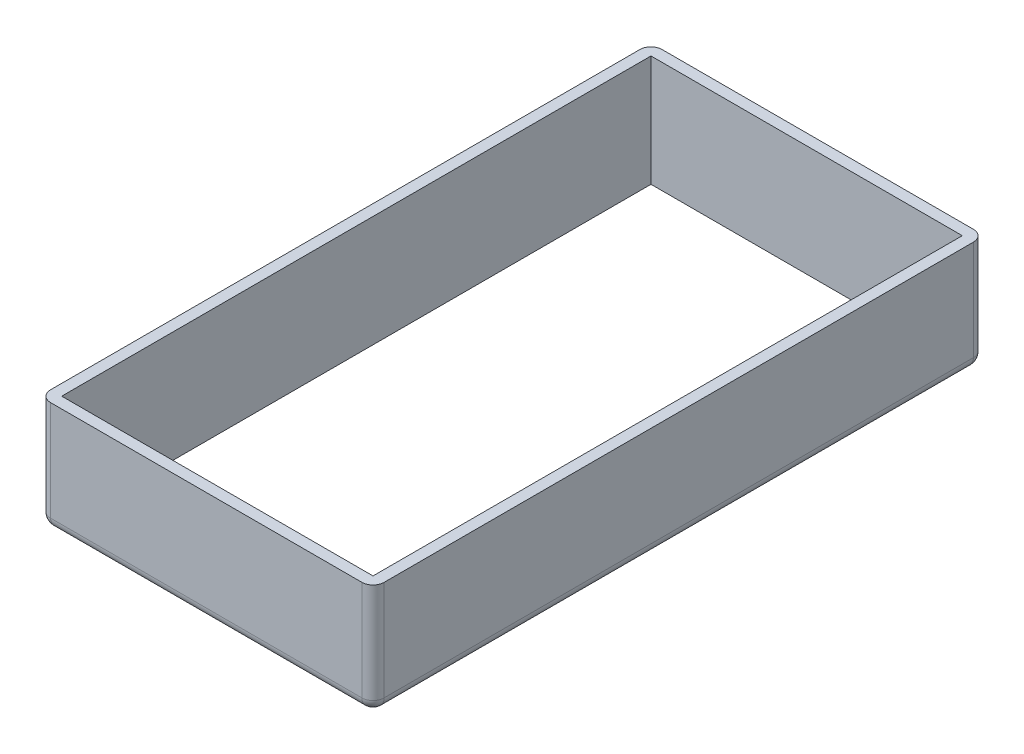
ISO-10303-21;
HEADER;
FILE_DESCRIPTION(('STEP AP214'),'2;1');
FILE_NAME('part.step','',(''),(''),'','','');
FILE_SCHEMA(('AUTOMOTIVE_DESIGN { 1 0 10303 214 1 1 1 1 }'));
ENDSEC;
DATA;
#1=APPLICATION_CONTEXT('core data for automotive mechanical design processes');
#2=APPLICATION_PROTOCOL_DEFINITION('international standard','automotive_design',2000,#1);
#3=PRODUCT_CONTEXT('',#1,'mechanical');
#4=PRODUCT('Part','Part','',(#3));
#5=PRODUCT_RELATED_PRODUCT_CATEGORY('part','',(#4));
#6=PRODUCT_DEFINITION_FORMATION('','',#4);
#7=PRODUCT_DEFINITION_CONTEXT('part definition',#1,'design');
#8=PRODUCT_DEFINITION('design','',#6,#7);
#9=PRODUCT_DEFINITION_SHAPE('','',#8);
#10=(LENGTH_UNIT() NAMED_UNIT(*) SI_UNIT(.MILLI.,.METRE.));
#11=(NAMED_UNIT(*) PLANE_ANGLE_UNIT() SI_UNIT($,.RADIAN.));
#12=(NAMED_UNIT(*) SI_UNIT($,.STERADIAN.) SOLID_ANGLE_UNIT());
#13=UNCERTAINTY_MEASURE_WITH_UNIT(LENGTH_MEASURE(1.E-05),#10,'distance_accuracy_value','');
#14=(GEOMETRIC_REPRESENTATION_CONTEXT(3) GLOBAL_UNCERTAINTY_ASSIGNED_CONTEXT((#13)) GLOBAL_UNIT_ASSIGNED_CONTEXT((#10,
#11,#12)) REPRESENTATION_CONTEXT('',''));
#15=CARTESIAN_POINT('',(0.,0.,0.));
#16=DIRECTION('',(0.,0.,1.));
#17=DIRECTION('',(1.,0.,0.));
#18=AXIS2_PLACEMENT_3D('',#15,#16,#17);
#19=CARTESIAN_POINT('',(-113.513034188034,25.4,-55.3725427350427));
#20=DIRECTION('',(1.,0.,0.));
#21=DIRECTION('',(0.,0.,-1.));
#22=AXIS2_PLACEMENT_3D('',#19,#20,#21);
#23=PLANE('',#22);
#24=DIRECTION('',(0.,0.,1.));
#25=VECTOR('',#24,1.);
#26=CARTESIAN_POINT('',(-113.513034188034,25.4,-55.3725427350427));
#27=LINE('',#26,#25);
#28=CARTESIAN_POINT('',(-113.513034188034,25.4,-52.8325427350427));
#29=VERTEX_POINT('',#28);
#30=CARTESIAN_POINT('',(-113.513034188034,25.4,81.7874572649573));
#31=VERTEX_POINT('',#30);
#32=EDGE_CURVE('E226',#29,#31,#27,.T.);
#33=ORIENTED_EDGE('',*,*,#32,.F.);
#34=DIRECTION('',(0.,-1.,0.));
#35=VECTOR('',#34,1.);
#36=CARTESIAN_POINT('',(-113.513034188034,25.4,-52.8325427350427));
#37=LINE('',#36,#35);
#38=CARTESIAN_POINT('',(-113.513034188034,2.54,-52.8325427350427));
#39=VERTEX_POINT('',#38);
#40=EDGE_CURVE('E67',#29,#39,#37,.T.);
#41=ORIENTED_EDGE('',*,*,#40,.T.);
#42=DIRECTION('',(0.,0.,1.));
#43=VECTOR('',#42,1.);
#44=CARTESIAN_POINT('',(-113.513034188034,2.54,-55.3725427350427));
#45=LINE('',#44,#43);
#46=CARTESIAN_POINT('',(-113.513034188034,2.54,81.7874572649573));
#47=VERTEX_POINT('',#46);
#48=EDGE_CURVE('E193',#39,#47,#45,.T.);
#49=ORIENTED_EDGE('',*,*,#48,.T.);
#50=DIRECTION('',(0.,-1.,0.));
#51=VECTOR('',#50,1.);
#52=CARTESIAN_POINT('',(-113.513034188034,25.4,81.7874572649573));
#53=LINE('',#52,#51);
#54=EDGE_CURVE('E191',#47,#31,#53,.F.);
#55=ORIENTED_EDGE('',*,*,#54,.T.);
#56=EDGE_LOOP('',(#33,#41,#49,#55));
#57=FACE_BOUND('',#56,.T.);
#58=ADVANCED_FACE('F43',(#57),#23,.F.);
#59=CARTESIAN_POINT('',(-113.513034188034,25.4,84.3274572649573));
#60=DIRECTION('',(0.,0.,-1.));
#61=DIRECTION('',(-1.,0.,0.));
#62=AXIS2_PLACEMENT_3D('',#59,#60,#61);
#63=PLANE('',#62);
#64=DIRECTION('',(1.,0.,0.));
#65=VECTOR('',#64,1.);
#66=CARTESIAN_POINT('',(-113.513034188034,2.54,84.3274572649573));
#67=LINE('',#66,#65);
#68=CARTESIAN_POINT('',(-110.973034188034,2.54,84.3274572649573));
#69=VERTEX_POINT('',#68);
#70=CARTESIAN_POINT('',(-39.8530341880342,2.54,84.3274572649573));
#71=VERTEX_POINT('',#70);
#72=EDGE_CURVE('E257',#69,#71,#67,.T.);
#73=ORIENTED_EDGE('',*,*,#72,.T.);
#74=DIRECTION('',(0.,-1.,0.));
#75=VECTOR('',#74,1.);
#76=CARTESIAN_POINT('',(-39.8530341880342,25.4,84.3274572649573));
#77=LINE('',#76,#75);
#78=CARTESIAN_POINT('',(-39.8530341880342,25.4,84.3274572649573));
#79=VERTEX_POINT('',#78);
#80=EDGE_CURVE('E260',#71,#79,#77,.F.);
#81=ORIENTED_EDGE('',*,*,#80,.T.);
#82=DIRECTION('',(1.,0.,0.));
#83=VECTOR('',#82,1.);
#84=CARTESIAN_POINT('',(-113.513034188034,25.4,84.3274572649573));
#85=LINE('',#84,#83);
#86=CARTESIAN_POINT('',(-110.973034188034,25.4,84.3274572649573));
#87=VERTEX_POINT('',#86);
#88=EDGE_CURVE('E246',#87,#79,#85,.T.);
#89=ORIENTED_EDGE('',*,*,#88,.F.);
#90=DIRECTION('',(0.,-1.,0.));
#91=VECTOR('',#90,1.);
#92=CARTESIAN_POINT('',(-110.973034188034,25.4,84.3274572649573));
#93=LINE('',#92,#91);
#94=EDGE_CURVE('E255',#87,#69,#93,.T.);
#95=ORIENTED_EDGE('',*,*,#94,.T.);
#96=EDGE_LOOP('',(#73,#81,#89,#95));
#97=FACE_BOUND('',#96,.T.);
#98=ADVANCED_FACE('F307',(#97),#63,.F.);
#99=CARTESIAN_POINT('',(-37.3130341880342,25.4,-55.3725427350427));
#100=DIRECTION('',(-1.,0.,0.));
#101=DIRECTION('',(0.,0.,1.));
#102=AXIS2_PLACEMENT_3D('',#99,#100,#101);
#103=PLANE('',#102);
#104=DIRECTION('',(0.,0.,-1.));
#105=VECTOR('',#104,1.);
#106=CARTESIAN_POINT('',(-37.3130341880342,2.54,-55.3725427350427));
#107=LINE('',#106,#105);
#108=CARTESIAN_POINT('',(-37.3130341880342,2.54,81.7874572649573));
#109=VERTEX_POINT('',#108);
#110=CARTESIAN_POINT('',(-37.3130341880342,2.54,-52.8325427350427));
#111=VERTEX_POINT('',#110);
#112=EDGE_CURVE('E182',#109,#111,#107,.T.);
#113=ORIENTED_EDGE('',*,*,#112,.T.);
#114=DIRECTION('',(0.,-1.,0.));
#115=VECTOR('',#114,1.);
#116=CARTESIAN_POINT('',(-37.3130341880342,25.4,-52.8325427350427));
#117=LINE('',#116,#115);
#118=CARTESIAN_POINT('',(-37.3130341880342,25.4,-52.8325427350427));
#119=VERTEX_POINT('',#118);
#120=EDGE_CURVE('E184',#111,#119,#117,.F.);
#121=ORIENTED_EDGE('',*,*,#120,.T.);
#122=DIRECTION('',(0.,0.,-1.));
#123=VECTOR('',#122,1.);
#124=CARTESIAN_POINT('',(-37.3130341880342,25.4,-55.3725427350427));
#125=LINE('',#124,#123);
#126=CARTESIAN_POINT('',(-37.3130341880342,25.4,81.7874572649573));
#127=VERTEX_POINT('',#126);
#128=EDGE_CURVE('E249',#127,#119,#125,.T.);
#129=ORIENTED_EDGE('',*,*,#128,.F.);
#130=DIRECTION('',(0.,-1.,0.));
#131=VECTOR('',#130,1.);
#132=CARTESIAN_POINT('',(-37.3130341880342,25.4,81.7874572649573));
#133=LINE('',#132,#131);
#134=EDGE_CURVE('E177',#127,#109,#133,.T.);
#135=ORIENTED_EDGE('',*,*,#134,.T.);
#136=EDGE_LOOP('',(#113,#121,#129,#135));
#137=FACE_BOUND('',#136,.T.);
#138=ADVANCED_FACE('F283',(#137),#103,.F.);
#139=CARTESIAN_POINT('',(-113.513034188034,25.4,-55.3725427350427));
#140=DIRECTION('',(0.,0.,1.));
#141=DIRECTION('',(1.,0.,0.));
#142=AXIS2_PLACEMENT_3D('',#139,#140,#141);
#143=PLANE('',#142);
#144=DIRECTION('',(-1.,0.,0.));
#145=VECTOR('',#144,1.);
#146=CARTESIAN_POINT('',(-113.513034188034,25.4,-55.3725427350427));
#147=LINE('',#146,#145);
#148=CARTESIAN_POINT('',(-39.8530341880342,25.4,-55.3725427350427));
#149=VERTEX_POINT('',#148);
#150=CARTESIAN_POINT('',(-110.973034188034,25.4,-55.3725427350427));
#151=VERTEX_POINT('',#150);
#152=EDGE_CURVE('E252',#149,#151,#147,.T.);
#153=ORIENTED_EDGE('',*,*,#152,.F.);
#154=DIRECTION('',(0.,-1.,0.));
#155=VECTOR('',#154,1.);
#156=CARTESIAN_POINT('',(-39.8530341880342,25.4,-55.3725427350427));
#157=LINE('',#156,#155);
#158=CARTESIAN_POINT('',(-39.8530341880342,2.54,-55.3725427350427));
#159=VERTEX_POINT('',#158);
#160=EDGE_CURVE('E189',#149,#159,#157,.T.);
#161=ORIENTED_EDGE('',*,*,#160,.T.);
#162=DIRECTION('',(-1.,0.,0.));
#163=VECTOR('',#162,1.);
#164=CARTESIAN_POINT('',(-113.513034188034,2.54,-55.3725427350427));
#165=LINE('',#164,#163);
#166=CARTESIAN_POINT('',(-110.973034188034,2.54,-55.3725427350427));
#167=VERTEX_POINT('',#166);
#168=EDGE_CURVE('E156',#159,#167,#165,.T.);
#169=ORIENTED_EDGE('',*,*,#168,.T.);
#170=DIRECTION('',(0.,-1.,0.));
#171=VECTOR('',#170,1.);
#172=CARTESIAN_POINT('',(-110.973034188034,25.4,-55.3725427350427));
#173=LINE('',#172,#171);
#174=EDGE_CURVE('E186',#167,#151,#173,.F.);
#175=ORIENTED_EDGE('',*,*,#174,.T.);
#176=EDGE_LOOP('',(#153,#161,#169,#175));
#177=FACE_BOUND('',#176,.T.);
#178=ADVANCED_FACE('F275',(#177),#143,.F.);
#179=CARTESIAN_POINT('',(0.,25.4,0.));
#180=DIRECTION('',(0.,1.,0.));
#181=DIRECTION('',(0.,0.,1.));
#182=AXIS2_PLACEMENT_3D('',#179,#180,#181);
#183=PLANE('',#182);
#184=DIRECTION('',(0.,0.,-1.));
#185=VECTOR('',#184,1.);
#186=CARTESIAN_POINT('',(-39.8530341880342,25.4,81.7874572649573));
#187=LINE('',#186,#185);
#188=CARTESIAN_POINT('',(-39.8530341880342,25.4,81.7874572649573));
#189=VERTEX_POINT('',#188);
#190=CARTESIAN_POINT('',(-39.8530341880342,25.4,-52.8325427350427));
#191=VERTEX_POINT('',#190);
#192=EDGE_CURVE('E138',#189,#191,#187,.T.);
#193=ORIENTED_EDGE('',*,*,#192,.F.);
#194=DIRECTION('',(1.,0.,0.));
#195=VECTOR('',#194,1.);
#196=CARTESIAN_POINT('',(-39.8530341880342,25.4,81.7874572649573));
#197=LINE('',#196,#195);
#198=CARTESIAN_POINT('',(-110.973034188034,25.4,81.7874572649573));
#199=VERTEX_POINT('',#198);
#200=EDGE_CURVE('E207',#199,#189,#197,.T.);
#201=ORIENTED_EDGE('',*,*,#200,.F.);
#202=DIRECTION('',(0.,0.,1.));
#203=VECTOR('',#202,1.);
#204=CARTESIAN_POINT('',(-110.973034188034,25.4,81.7874572649573));
#205=LINE('',#204,#203);
#206=CARTESIAN_POINT('',(-110.973034188034,25.4,-52.8325427350427));
#207=VERTEX_POINT('',#206);
#208=EDGE_CURVE('E234',#207,#199,#205,.T.);
#209=ORIENTED_EDGE('',*,*,#208,.F.);
#210=DIRECTION('',(-1.,0.,0.));
#211=VECTOR('',#210,1.);
#212=CARTESIAN_POINT('',(-39.8530341880342,25.4,-52.8325427350427));
#213=LINE('',#212,#211);
#214=EDGE_CURVE('E237',#191,#207,#213,.T.);
#215=ORIENTED_EDGE('',*,*,#214,.F.);
#216=EDGE_LOOP('',(#193,#201,#209,#215));
#217=FACE_BOUND('',#216,.T.);
#218=ORIENTED_EDGE('',*,*,#128,.T.);
#219=CARTESIAN_POINT('',(-39.8530341880342,25.4,-52.8325427350427));
#220=DIRECTION('',(0.,1.,0.));
#221=DIRECTION('',(0.,0.,1.));
#222=AXIS2_PLACEMENT_3D('',#219,#220,#221);
#223=CIRCLE('',#222,2.54);
#224=EDGE_CURVE('E202',#119,#149,#223,.T.);
#225=ORIENTED_EDGE('',*,*,#224,.T.);
#226=ORIENTED_EDGE('',*,*,#152,.T.);
#227=CARTESIAN_POINT('',(-110.973034188034,25.4,-52.8325427350427));
#228=DIRECTION('',(0.,1.,0.));
#229=DIRECTION('',(0.,0.,1.));
#230=AXIS2_PLACEMENT_3D('',#227,#228,#229);
#231=CIRCLE('',#230,2.54);
#232=EDGE_CURVE('E200',#151,#29,#231,.T.);
#233=ORIENTED_EDGE('',*,*,#232,.T.);
#234=ORIENTED_EDGE('',*,*,#32,.T.);
#235=CARTESIAN_POINT('',(-110.973034188034,25.4,81.7874572649573));
#236=DIRECTION('',(0.,1.,0.));
#237=DIRECTION('',(0.,0.,1.));
#238=AXIS2_PLACEMENT_3D('',#235,#236,#237);
#239=CIRCLE('',#238,2.54);
#240=EDGE_CURVE('E196',#31,#87,#239,.T.);
#241=ORIENTED_EDGE('',*,*,#240,.T.);
#242=ORIENTED_EDGE('',*,*,#88,.T.);
#243=CARTESIAN_POINT('',(-39.8530341880342,25.4,81.7874572649573));
#244=DIRECTION('',(0.,1.,0.));
#245=DIRECTION('',(0.,0.,1.));
#246=AXIS2_PLACEMENT_3D('',#243,#244,#245);
#247=CIRCLE('',#246,2.54);
#248=EDGE_CURVE('E198',#79,#127,#247,.T.);
#249=ORIENTED_EDGE('',*,*,#248,.T.);
#250=EDGE_LOOP('',(#218,#225,#226,#233,#234,#241,#242,#249));
#251=FACE_BOUND('',#250,.T.);
#252=ADVANCED_FACE('F239',(#217,#251),#183,.T.);
#253=CARTESIAN_POINT('',(-110.973034188034,25.4,-52.8325427350427));
#254=DIRECTION('',(0.,-1.,0.));
#255=DIRECTION('',(0.,0.,-1.));
#256=AXIS2_PLACEMENT_3D('',#253,#254,#255);
#257=CYLINDRICAL_SURFACE('',#256,2.54);
#258=ORIENTED_EDGE('',*,*,#232,.F.);
#259=ORIENTED_EDGE('',*,*,#174,.F.);
#260=CARTESIAN_POINT('',(-110.973034188034,2.54,-52.8325427350427));
#261=DIRECTION('',(0.,-1.,0.));
#262=DIRECTION('',(0.,0.,-1.));
#263=AXIS2_PLACEMENT_3D('',#260,#261,#262);
#264=CIRCLE('',#263,2.54);
#265=EDGE_CURVE('E222',#39,#167,#264,.T.);
#266=ORIENTED_EDGE('',*,*,#265,.F.);
#267=ORIENTED_EDGE('',*,*,#40,.F.);
#268=EDGE_LOOP('',(#258,#259,#266,#267));
#269=FACE_BOUND('',#268,.T.);
#270=ADVANCED_FACE('F272',(#269),#257,.T.);
#271=CARTESIAN_POINT('',(-39.8530341880342,25.4,-52.8325427350427));
#272=DIRECTION('',(0.,-1.,0.));
#273=DIRECTION('',(0.,0.,-1.));
#274=AXIS2_PLACEMENT_3D('',#271,#272,#273);
#275=CYLINDRICAL_SURFACE('',#274,2.54);
#276=ORIENTED_EDGE('',*,*,#224,.F.);
#277=ORIENTED_EDGE('',*,*,#120,.F.);
#278=CARTESIAN_POINT('',(-39.8530341880342,2.54,-52.8325427350427));
#279=DIRECTION('',(0.,-1.,0.));
#280=DIRECTION('',(0.,0.,-1.));
#281=AXIS2_PLACEMENT_3D('',#278,#279,#280);
#282=CIRCLE('',#281,2.54);
#283=EDGE_CURVE('E160',#159,#111,#282,.T.);
#284=ORIENTED_EDGE('',*,*,#283,.F.);
#285=ORIENTED_EDGE('',*,*,#160,.F.);
#286=EDGE_LOOP('',(#276,#277,#284,#285));
#287=FACE_BOUND('',#286,.T.);
#288=ADVANCED_FACE('F281',(#287),#275,.T.);
#289=CARTESIAN_POINT('',(-113.513034188034,2.54,-52.8325427350427));
#290=DIRECTION('',(-1.,0.,0.));
#291=DIRECTION('',(0.,0.,1.));
#292=AXIS2_PLACEMENT_3D('',#289,#290,#291);
#293=CYLINDRICAL_SURFACE('',#292,2.54);
#294=CARTESIAN_POINT('',(-110.973034188034,2.54,-52.8325427350427));
#295=DIRECTION('',(-1.,0.,0.));
#296=DIRECTION('',(0.,0.,1.));
#297=AXIS2_PLACEMENT_3D('',#294,#295,#296);
#298=CIRCLE('',#297,2.54);
#299=CARTESIAN_POINT('',(-110.973034188034,0.,-52.8325427350427));
#300=VERTEX_POINT('',#299);
#301=EDGE_CURVE('E225',#167,#300,#298,.T.);
#302=ORIENTED_EDGE('',*,*,#301,.F.);
#303=ORIENTED_EDGE('',*,*,#168,.F.);
#304=CARTESIAN_POINT('',(-39.8530341880342,2.54,-52.8325427350427));
#305=DIRECTION('',(1.,0.,0.));
#306=DIRECTION('',(0.,0.,-1.));
#307=AXIS2_PLACEMENT_3D('',#304,#305,#306);
#308=CIRCLE('',#307,2.54);
#309=CARTESIAN_POINT('',(-39.8530341880342,0.,-52.8325427350427));
#310=VERTEX_POINT('',#309);
#311=EDGE_CURVE('E153',#310,#159,#308,.T.);
#312=ORIENTED_EDGE('',*,*,#311,.F.);
#313=DIRECTION('',(-1.,0.,0.));
#314=VECTOR('',#313,1.);
#315=CARTESIAN_POINT('',(0.,0.,-52.8325427350427));
#316=LINE('',#315,#314);
#317=EDGE_CURVE('E143',#300,#310,#316,.F.);
#318=ORIENTED_EDGE('',*,*,#317,.F.);
#319=EDGE_LOOP('',(#302,#303,#312,#318));
#320=FACE_BOUND('',#319,.T.);
#321=ADVANCED_FACE('F155',(#320),#293,.T.);
#322=CARTESIAN_POINT('',(-110.973034188034,2.54,-52.8325427350427));
#323=DIRECTION('',(0.,0.,-1.));
#324=DIRECTION('',(0.,1.,0.));
#325=AXIS2_PLACEMENT_3D('',#322,#323,#324);
#326=SPHERICAL_SURFACE('',#325,2.54);
#327=ORIENTED_EDGE('',*,*,#265,.T.);
#328=ORIENTED_EDGE('',*,*,#301,.T.);
#329=CARTESIAN_POINT('',(-110.973034188034,2.54,-52.8325427350427));
#330=DIRECTION('',(0.,0.,-1.));
#331=DIRECTION('',(-1.,0.,0.));
#332=AXIS2_PLACEMENT_3D('',#329,#330,#331);
#333=CIRCLE('',#332,2.54);
#334=EDGE_CURVE('E161',#39,#300,#333,.F.);
#335=ORIENTED_EDGE('',*,*,#334,.F.);
#336=EDGE_LOOP('',(#327,#328,#335));
#337=FACE_BOUND('',#336,.T.);
#338=ADVANCED_FACE('F268',(#337),#326,.T.);
#339=CARTESIAN_POINT('',(-39.8530341880342,2.54,-52.8325427350427));
#340=DIRECTION('',(0.,0.,-1.));
#341=DIRECTION('',(-1.,0.,0.));
#342=AXIS2_PLACEMENT_3D('',#339,#340,#341);
#343=SPHERICAL_SURFACE('',#342,2.54);
#344=ORIENTED_EDGE('',*,*,#311,.T.);
#345=ORIENTED_EDGE('',*,*,#283,.T.);
#346=CARTESIAN_POINT('',(-39.8530341880342,2.54,-52.8325427350427));
#347=DIRECTION('',(0.,0.,-1.));
#348=DIRECTION('',(-1.,0.,0.));
#349=AXIS2_PLACEMENT_3D('',#346,#347,#348);
#350=CIRCLE('',#349,2.54);
#351=EDGE_CURVE('E164',#310,#111,#350,.F.);
#352=ORIENTED_EDGE('',*,*,#351,.F.);
#353=EDGE_LOOP('',(#344,#345,#352));
#354=FACE_BOUND('',#353,.T.);
#355=ADVANCED_FACE('F165',(#354),#343,.T.);
#356=CARTESIAN_POINT('',(-110.973034188034,2.54,-55.3725427350427));
#357=DIRECTION('',(0.,0.,1.));
#358=DIRECTION('',(1.,0.,0.));
#359=AXIS2_PLACEMENT_3D('',#356,#357,#358);
#360=CYLINDRICAL_SURFACE('',#359,2.54);
#361=ORIENTED_EDGE('',*,*,#334,.T.);
#362=DIRECTION('',(0.,0.,1.));
#363=VECTOR('',#362,1.);
#364=CARTESIAN_POINT('',(-110.973034188034,0.,0.));
#365=LINE('',#364,#363);
#366=CARTESIAN_POINT('',(-110.973034188034,0.,81.7874572649573));
#367=VERTEX_POINT('',#366);
#368=EDGE_CURVE('E149',#367,#300,#365,.F.);
#369=ORIENTED_EDGE('',*,*,#368,.F.);
#370=CARTESIAN_POINT('',(-110.973034188034,2.54,81.7874572649573));
#371=DIRECTION('',(0.,0.,1.));
#372=DIRECTION('',(1.,0.,0.));
#373=AXIS2_PLACEMENT_3D('',#370,#371,#372);
#374=CIRCLE('',#373,2.54);
#375=EDGE_CURVE('E168',#47,#367,#374,.T.);
#376=ORIENTED_EDGE('',*,*,#375,.F.);
#377=ORIENTED_EDGE('',*,*,#48,.F.);
#378=EDGE_LOOP('',(#361,#369,#376,#377));
#379=FACE_BOUND('',#378,.T.);
#380=ADVANCED_FACE('F264',(#379),#360,.T.);
#381=CARTESIAN_POINT('',(-110.973034188034,25.4,81.7874572649573));
#382=DIRECTION('',(0.,-1.,0.));
#383=DIRECTION('',(0.,0.,-1.));
#384=AXIS2_PLACEMENT_3D('',#381,#382,#383);
#385=CYLINDRICAL_SURFACE('',#384,2.54);
#386=ORIENTED_EDGE('',*,*,#240,.F.);
#387=ORIENTED_EDGE('',*,*,#54,.F.);
#388=CARTESIAN_POINT('',(-110.973034188034,2.54,81.7874572649573));
#389=DIRECTION('',(0.,-1.,0.));
#390=DIRECTION('',(0.,0.,-1.));
#391=AXIS2_PLACEMENT_3D('',#388,#389,#390);
#392=CIRCLE('',#391,2.54);
#393=EDGE_CURVE('E214',#69,#47,#392,.T.);
#394=ORIENTED_EDGE('',*,*,#393,.F.);
#395=ORIENTED_EDGE('',*,*,#94,.F.);
#396=EDGE_LOOP('',(#386,#387,#394,#395));
#397=FACE_BOUND('',#396,.T.);
#398=ADVANCED_FACE('F304',(#397),#385,.T.);
#399=CARTESIAN_POINT('',(-39.8530341880342,25.4,81.7874572649573));
#400=DIRECTION('',(0.,-1.,0.));
#401=DIRECTION('',(0.,0.,-1.));
#402=AXIS2_PLACEMENT_3D('',#399,#400,#401);
#403=CYLINDRICAL_SURFACE('',#402,2.54);
#404=ORIENTED_EDGE('',*,*,#248,.F.);
#405=ORIENTED_EDGE('',*,*,#80,.F.);
#406=CARTESIAN_POINT('',(-39.8530341880342,2.54,81.7874572649573));
#407=DIRECTION('',(0.,-1.,0.));
#408=DIRECTION('',(0.,0.,-1.));
#409=AXIS2_PLACEMENT_3D('',#406,#407,#408);
#410=CIRCLE('',#409,2.54);
#411=EDGE_CURVE('E211',#109,#71,#410,.T.);
#412=ORIENTED_EDGE('',*,*,#411,.F.);
#413=ORIENTED_EDGE('',*,*,#134,.F.);
#414=EDGE_LOOP('',(#404,#405,#412,#413));
#415=FACE_BOUND('',#414,.T.);
#416=ADVANCED_FACE('F289',(#415),#403,.T.);
#417=CARTESIAN_POINT('',(-39.8530341880342,2.54,-55.3725427350427));
#418=DIRECTION('',(0.,0.,-1.));
#419=DIRECTION('',(-1.,0.,0.));
#420=AXIS2_PLACEMENT_3D('',#417,#418,#419);
#421=CYLINDRICAL_SURFACE('',#420,2.54);
#422=ORIENTED_EDGE('',*,*,#351,.T.);
#423=ORIENTED_EDGE('',*,*,#112,.F.);
#424=CARTESIAN_POINT('',(-39.8530341880342,2.54,81.7874572649573));
#425=DIRECTION('',(0.,0.,1.));
#426=DIRECTION('',(1.,0.,0.));
#427=AXIS2_PLACEMENT_3D('',#424,#425,#426);
#428=CIRCLE('',#427,2.54);
#429=CARTESIAN_POINT('',(-39.8530341880342,0.,81.7874572649573));
#430=VERTEX_POINT('',#429);
#431=EDGE_CURVE('E172',#430,#109,#428,.T.);
#432=ORIENTED_EDGE('',*,*,#431,.F.);
#433=DIRECTION('',(0.,0.,-1.));
#434=VECTOR('',#433,1.);
#435=CARTESIAN_POINT('',(-39.8530341880342,0.,0.));
#436=LINE('',#435,#434);
#437=EDGE_CURVE('E135',#310,#430,#436,.F.);
#438=ORIENTED_EDGE('',*,*,#437,.F.);
#439=EDGE_LOOP('',(#422,#423,#432,#438));
#440=FACE_BOUND('',#439,.T.);
#441=ADVANCED_FACE('F170',(#440),#421,.T.);
#442=CARTESIAN_POINT('',(-110.973034188034,2.54,81.7874572649573));
#443=DIRECTION('',(-1.,0.,0.));
#444=DIRECTION('',(0.,-1.,0.));
#445=AXIS2_PLACEMENT_3D('',#442,#443,#444);
#446=SPHERICAL_SURFACE('',#445,2.54);
#447=ORIENTED_EDGE('',*,*,#393,.T.);
#448=ORIENTED_EDGE('',*,*,#375,.T.);
#449=CARTESIAN_POINT('',(-110.973034188034,2.54,81.7874572649573));
#450=DIRECTION('',(-1.,0.,0.));
#451=DIRECTION('',(0.,0.,1.));
#452=AXIS2_PLACEMENT_3D('',#449,#450,#451);
#453=CIRCLE('',#452,2.54);
#454=EDGE_CURVE('E206',#69,#367,#453,.F.);
#455=ORIENTED_EDGE('',*,*,#454,.F.);
#456=EDGE_LOOP('',(#447,#448,#455));
#457=FACE_BOUND('',#456,.T.);
#458=ADVANCED_FACE('F298',(#457),#446,.T.);
#459=CARTESIAN_POINT('',(-39.8530341880342,2.54,81.7874572649573));
#460=DIRECTION('',(1.,0.,0.));
#461=DIRECTION('',(0.,0.,-1.));
#462=AXIS2_PLACEMENT_3D('',#459,#460,#461);
#463=SPHERICAL_SURFACE('',#462,2.54);
#464=ORIENTED_EDGE('',*,*,#431,.T.);
#465=ORIENTED_EDGE('',*,*,#411,.T.);
#466=CARTESIAN_POINT('',(-39.8530341880342,2.54,81.7874572649573));
#467=DIRECTION('',(1.,0.,0.));
#468=DIRECTION('',(0.,0.,-1.));
#469=AXIS2_PLACEMENT_3D('',#466,#467,#468);
#470=CIRCLE('',#469,2.54);
#471=EDGE_CURVE('E204',#430,#71,#470,.F.);
#472=ORIENTED_EDGE('',*,*,#471,.F.);
#473=EDGE_LOOP('',(#464,#465,#472));
#474=FACE_BOUND('',#473,.T.);
#475=ADVANCED_FACE('F292',(#474),#463,.T.);
#476=CARTESIAN_POINT('',(-113.513034188034,2.54,81.7874572649573));
#477=DIRECTION('',(1.,0.,0.));
#478=DIRECTION('',(0.,0.,-1.));
#479=AXIS2_PLACEMENT_3D('',#476,#477,#478);
#480=CYLINDRICAL_SURFACE('',#479,2.54);
#481=ORIENTED_EDGE('',*,*,#454,.T.);
#482=DIRECTION('',(1.,0.,0.));
#483=VECTOR('',#482,1.);
#484=CARTESIAN_POINT('',(0.,0.,81.7874572649573));
#485=LINE('',#484,#483);
#486=EDGE_CURVE('E174',#430,#367,#485,.F.);
#487=ORIENTED_EDGE('',*,*,#486,.F.);
#488=ORIENTED_EDGE('',*,*,#471,.T.);
#489=ORIENTED_EDGE('',*,*,#72,.F.);
#490=EDGE_LOOP('',(#481,#487,#488,#489));
#491=FACE_BOUND('',#490,.T.);
#492=ADVANCED_FACE('F295',(#491),#480,.T.);
#493=CARTESIAN_POINT('',(-110.973034188034,25.4,-55.3725427350427));
#494=DIRECTION('',(1.,0.,0.));
#495=DIRECTION('',(0.,0.,-1.));
#496=AXIS2_PLACEMENT_3D('',#493,#494,#495);
#497=PLANE('',#496);
#498=DIRECTION('',(0.,1.,0.));
#499=VECTOR('',#498,1.);
#500=CARTESIAN_POINT('',(-110.973034188034,25.4,-52.8325427350427));
#501=LINE('',#500,#499);
#502=EDGE_CURVE('E11',#300,#207,#501,.T.);
#503=ORIENTED_EDGE('',*,*,#502,.T.);
#504=ORIENTED_EDGE('',*,*,#208,.T.);
#505=DIRECTION('',(0.,1.,0.));
#506=VECTOR('',#505,1.);
#507=CARTESIAN_POINT('',(-110.973034188034,25.4,81.7874572649573));
#508=LINE('',#507,#506);
#509=EDGE_CURVE('E47',#367,#199,#508,.T.);
#510=ORIENTED_EDGE('',*,*,#509,.F.);
#511=ORIENTED_EDGE('',*,*,#368,.T.);
#512=EDGE_LOOP('',(#503,#504,#510,#511));
#513=FACE_BOUND('',#512,.T.);
#514=ADVANCED_FACE('F235',(#513),#497,.T.);
#515=CARTESIAN_POINT('',(-113.513034188034,25.4,81.7874572649573));
#516=DIRECTION('',(0.,0.,-1.));
#517=DIRECTION('',(-1.,0.,0.));
#518=AXIS2_PLACEMENT_3D('',#515,#516,#517);
#519=PLANE('',#518);
#520=DIRECTION('',(0.,1.,0.));
#521=VECTOR('',#520,1.);
#522=CARTESIAN_POINT('',(-39.8530341880342,25.4,81.7874572649573));
#523=LINE('',#522,#521);
#524=EDGE_CURVE('E140',#430,#189,#523,.T.);
#525=ORIENTED_EDGE('',*,*,#524,.F.);
#526=ORIENTED_EDGE('',*,*,#486,.T.);
#527=ORIENTED_EDGE('',*,*,#509,.T.);
#528=ORIENTED_EDGE('',*,*,#200,.T.);
#529=EDGE_LOOP('',(#525,#526,#527,#528));
#530=FACE_BOUND('',#529,.T.);
#531=ADVANCED_FACE('F230',(#530),#519,.T.);
#532=CARTESIAN_POINT('',(-39.8530341880342,25.4,-55.3725427350427));
#533=DIRECTION('',(-1.,0.,0.));
#534=DIRECTION('',(0.,0.,1.));
#535=AXIS2_PLACEMENT_3D('',#532,#533,#534);
#536=PLANE('',#535);
#537=DIRECTION('',(0.,1.,0.));
#538=VECTOR('',#537,1.);
#539=CARTESIAN_POINT('',(-39.8530341880342,25.4,-52.8325427350427));
#540=LINE('',#539,#538);
#541=EDGE_CURVE('E52',#310,#191,#540,.T.);
#542=ORIENTED_EDGE('',*,*,#541,.F.);
#543=ORIENTED_EDGE('',*,*,#437,.T.);
#544=ORIENTED_EDGE('',*,*,#524,.T.);
#545=ORIENTED_EDGE('',*,*,#192,.T.);
#546=EDGE_LOOP('',(#542,#543,#544,#545));
#547=FACE_BOUND('',#546,.T.);
#548=ADVANCED_FACE('F133',(#547),#536,.T.);
#549=CARTESIAN_POINT('',(-113.513034188034,25.4,-52.8325427350427));
#550=DIRECTION('',(0.,0.,1.));
#551=DIRECTION('',(1.,0.,0.));
#552=AXIS2_PLACEMENT_3D('',#549,#550,#551);
#553=PLANE('',#552);
#554=ORIENTED_EDGE('',*,*,#541,.T.);
#555=ORIENTED_EDGE('',*,*,#214,.T.);
#556=ORIENTED_EDGE('',*,*,#502,.F.);
#557=ORIENTED_EDGE('',*,*,#317,.T.);
#558=EDGE_LOOP('',(#554,#555,#556,#557));
#559=FACE_BOUND('',#558,.T.);
#560=ADVANCED_FACE('F45',(#559),#553,.T.);
#561=CLOSED_SHELL('',(#58,#98,#138,#178,#252,#270,#288,#321,#338,#355,#380,#398,#416,#441,#458,
#475,#492,#514,#531,#548,#560));
#562=MANIFOLD_SOLID_BREP('B2',#561);
#563=ADVANCED_BREP_SHAPE_REPRESENTATION('',(#18,#562),#14);
#564=SHAPE_DEFINITION_REPRESENTATION(#9,#563);
ENDSEC;
END-ISO-10303-21;
